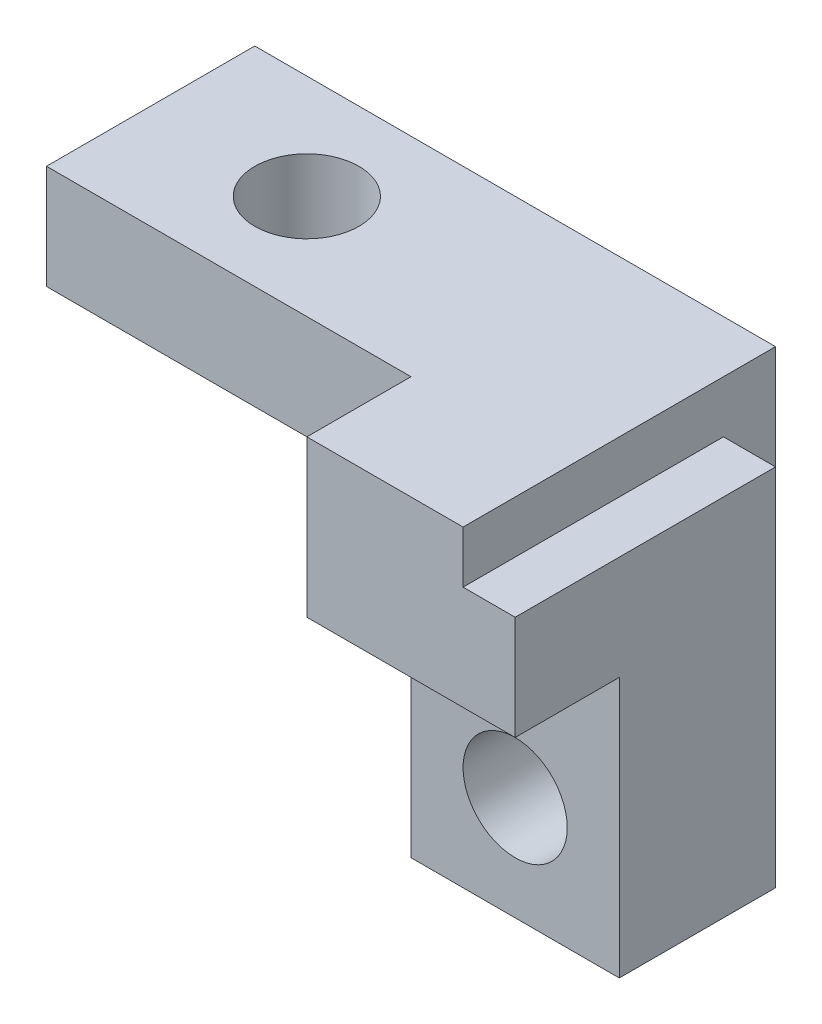
ISO-10303-21;
HEADER;
FILE_DESCRIPTION(('STEP AP214'),'2;1');
FILE_NAME('part.step','',(''),(''),'','','');
FILE_SCHEMA(('AUTOMOTIVE_DESIGN { 1 0 10303 214 1 1 1 1 }'));
ENDSEC;
DATA;
#1=APPLICATION_CONTEXT('core data for automotive mechanical design processes');
#2=APPLICATION_PROTOCOL_DEFINITION('international standard','automotive_design',2000,#1);
#3=PRODUCT_CONTEXT('',#1,'mechanical');
#4=PRODUCT('Part','Part','',(#3));
#5=PRODUCT_RELATED_PRODUCT_CATEGORY('part','',(#4));
#6=PRODUCT_DEFINITION_FORMATION('','',#4);
#7=PRODUCT_DEFINITION_CONTEXT('part definition',#1,'design');
#8=PRODUCT_DEFINITION('design','',#6,#7);
#9=PRODUCT_DEFINITION_SHAPE('','',#8);
#10=(LENGTH_UNIT() NAMED_UNIT(*) SI_UNIT(.MILLI.,.METRE.));
#11=(NAMED_UNIT(*) PLANE_ANGLE_UNIT() SI_UNIT($,.RADIAN.));
#12=(NAMED_UNIT(*) SI_UNIT($,.STERADIAN.) SOLID_ANGLE_UNIT());
#13=UNCERTAINTY_MEASURE_WITH_UNIT(LENGTH_MEASURE(1.E-05),#10,'distance_accuracy_value','');
#14=(GEOMETRIC_REPRESENTATION_CONTEXT(3) GLOBAL_UNCERTAINTY_ASSIGNED_CONTEXT((#13)) GLOBAL_UNIT_ASSIGNED_CONTEXT((#10,
#11,#12)) REPRESENTATION_CONTEXT('',''));
#15=CARTESIAN_POINT('',(0.,0.,0.));
#16=DIRECTION('',(0.,0.,1.));
#17=DIRECTION('',(1.,0.,0.));
#18=AXIS2_PLACEMENT_3D('',#15,#16,#17);
#19=CARTESIAN_POINT('',(241.3,28.575,-63.5));
#20=DIRECTION('',(1.,0.,0.));
#21=DIRECTION('',(0.,0.,-1.));
#22=AXIS2_PLACEMENT_3D('',#19,#20,#21);
#23=PLANE('',#22);
#24=DIRECTION('',(0.,0.,1.));
#25=VECTOR('',#24,1.);
#26=CARTESIAN_POINT('',(241.3,92.075,0.));
#27=LINE('',#26,#25);
#28=CARTESIAN_POINT('',(241.3,92.075,-25.4));
#29=VERTEX_POINT('',#28);
#30=CARTESIAN_POINT('',(241.3,92.075,0.));
#31=VERTEX_POINT('',#30);
#32=EDGE_CURVE('E148',#29,#31,#27,.T.);
#33=ORIENTED_EDGE('',*,*,#32,.F.);
#34=DIRECTION('',(0.,1.,0.));
#35=VECTOR('',#34,1.);
#36=CARTESIAN_POINT('',(241.3,92.075,-25.4));
#37=LINE('',#36,#35);
#38=CARTESIAN_POINT('',(241.3,28.575,-25.4));
#39=VERTEX_POINT('',#38);
#40=EDGE_CURVE('E139',#39,#29,#37,.T.);
#41=ORIENTED_EDGE('',*,*,#40,.F.);
#42=DIRECTION('',(0.,0.,-1.));
#43=VECTOR('',#42,1.);
#44=CARTESIAN_POINT('',(241.3,28.575,-63.5));
#45=LINE('',#44,#43);
#46=CARTESIAN_POINT('',(241.3,28.575,-63.5));
#47=VERTEX_POINT('',#46);
#48=EDGE_CURVE('E145',#39,#47,#45,.T.);
#49=ORIENTED_EDGE('',*,*,#48,.T.);
#50=DIRECTION('',(0.,1.,0.));
#51=VECTOR('',#50,1.);
#52=CARTESIAN_POINT('',(241.3,28.575,-63.5));
#53=LINE('',#52,#51);
#54=CARTESIAN_POINT('',(241.3,117.475,-63.5));
#55=VERTEX_POINT('',#54);
#56=EDGE_CURVE('E173',#47,#55,#53,.T.);
#57=ORIENTED_EDGE('',*,*,#56,.T.);
#58=DIRECTION('',(0.,0.,1.));
#59=VECTOR('',#58,1.);
#60=CARTESIAN_POINT('',(241.3,117.475,-76.2));
#61=LINE('',#60,#59);
#62=CARTESIAN_POINT('',(241.3,117.475,0.));
#63=VERTEX_POINT('',#62);
#64=EDGE_CURVE('E217',#55,#63,#61,.T.);
#65=ORIENTED_EDGE('',*,*,#64,.T.);
#66=DIRECTION('',(0.,1.,0.));
#67=VECTOR('',#66,1.);
#68=CARTESIAN_POINT('',(241.3,28.575,0.));
#69=LINE('',#68,#67);
#70=EDGE_CURVE('E188',#31,#63,#69,.T.);
#71=ORIENTED_EDGE('',*,*,#70,.F.);
#72=EDGE_LOOP('',(#33,#41,#49,#57,#65,#71));
#73=FACE_BOUND('',#72,.T.);
#74=ADVANCED_FACE('F50',(#73),#23,.T.);
#75=CARTESIAN_POINT('',(241.3,28.575,0.));
#76=DIRECTION('',(0.,0.,1.));
#77=DIRECTION('',(1.,0.,0.));
#78=AXIS2_PLACEMENT_3D('',#75,#76,#77);
#79=PLANE('',#78);
#80=DIRECTION('',(1.,0.,0.));
#81=VECTOR('',#80,1.);
#82=CARTESIAN_POINT('',(101.6,92.075,0.));
#83=LINE('',#82,#81);
#84=CARTESIAN_POINT('',(190.5,92.075,0.));
#85=VERTEX_POINT('',#84);
#86=EDGE_CURVE('E257',#85,#31,#83,.T.);
#87=ORIENTED_EDGE('',*,*,#86,.T.);
#88=ORIENTED_EDGE('',*,*,#70,.T.);
#89=DIRECTION('',(1.,0.,0.));
#90=VECTOR('',#89,1.);
#91=CARTESIAN_POINT('',(0.,117.475,0.));
#92=LINE('',#91,#90);
#93=CARTESIAN_POINT('',(228.6,117.475,0.));
#94=VERTEX_POINT('',#93);
#95=EDGE_CURVE('E224',#94,#63,#92,.T.);
#96=ORIENTED_EDGE('',*,*,#95,.F.);
#97=DIRECTION('',(0.,-1.,0.));
#98=VECTOR('',#97,1.);
#99=CARTESIAN_POINT('',(228.6,0.,0.));
#100=LINE('',#99,#98);
#101=CARTESIAN_POINT('',(228.6,130.175,0.));
#102=VERTEX_POINT('',#101);
#103=EDGE_CURVE('E222',#102,#94,#100,.T.);
#104=ORIENTED_EDGE('',*,*,#103,.F.);
#105=DIRECTION('',(1.,0.,0.));
#106=VECTOR('',#105,1.);
#107=CARTESIAN_POINT('',(241.3,130.175,0.));
#108=LINE('',#107,#106);
#109=CARTESIAN_POINT('',(190.5,130.175,0.));
#110=VERTEX_POINT('',#109);
#111=EDGE_CURVE('E156',#110,#102,#108,.T.);
#112=ORIENTED_EDGE('',*,*,#111,.F.);
#113=DIRECTION('',(0.,1.,0.));
#114=VECTOR('',#113,1.);
#115=CARTESIAN_POINT('',(190.5,28.575,0.));
#116=LINE('',#115,#114);
#117=EDGE_CURVE('E190',#85,#110,#116,.T.);
#118=ORIENTED_EDGE('',*,*,#117,.F.);
#119=EDGE_LOOP('',(#87,#88,#96,#104,#112,#118));
#120=FACE_BOUND('',#119,.T.);
#121=ADVANCED_FACE('F256',(#120),#79,.T.);
#122=CARTESIAN_POINT('',(190.5,28.575,0.));
#123=DIRECTION('',(-1.,0.,0.));
#124=DIRECTION('',(0.,0.,1.));
#125=AXIS2_PLACEMENT_3D('',#122,#123,#124);
#126=PLANE('',#125);
#127=DIRECTION('',(0.,0.,-1.));
#128=VECTOR('',#127,1.);
#129=CARTESIAN_POINT('',(190.5,92.075,0.));
#130=LINE('',#129,#128);
#131=CARTESIAN_POINT('',(190.5,92.075,-25.4));
#132=VERTEX_POINT('',#131);
#133=EDGE_CURVE('E14',#85,#132,#130,.T.);
#134=ORIENTED_EDGE('',*,*,#133,.F.);
#135=ORIENTED_EDGE('',*,*,#117,.T.);
#136=DIRECTION('',(0.,0.,1.));
#137=VECTOR('',#136,1.);
#138=CARTESIAN_POINT('',(190.5,130.175,0.));
#139=LINE('',#138,#137);
#140=CARTESIAN_POINT('',(190.5,130.175,-25.4));
#141=VERTEX_POINT('',#140);
#142=EDGE_CURVE('E161',#141,#110,#139,.T.);
#143=ORIENTED_EDGE('',*,*,#142,.F.);
#144=DIRECTION('',(0.,1.,0.));
#145=VECTOR('',#144,1.);
#146=CARTESIAN_POINT('',(190.5,28.575,-25.4));
#147=LINE('',#146,#145);
#148=CARTESIAN_POINT('',(190.5,104.775,-25.4));
#149=VERTEX_POINT('',#148);
#150=EDGE_CURVE('E192',#149,#141,#147,.T.);
#151=ORIENTED_EDGE('',*,*,#150,.F.);
#152=DIRECTION('',(0.,0.,1.));
#153=VECTOR('',#152,1.);
#154=CARTESIAN_POINT('',(190.5,104.775,-76.2));
#155=LINE('',#154,#153);
#156=CARTESIAN_POINT('',(190.5,104.775,-76.2));
#157=VERTEX_POINT('',#156);
#158=EDGE_CURVE('E237',#157,#149,#155,.T.);
#159=ORIENTED_EDGE('',*,*,#158,.F.);
#160=DIRECTION('',(0.,1.,0.));
#161=VECTOR('',#160,1.);
#162=CARTESIAN_POINT('',(190.5,92.075,-76.2));
#163=LINE('',#162,#161);
#164=CARTESIAN_POINT('',(190.5,28.575,-76.2));
#165=VERTEX_POINT('',#164);
#166=EDGE_CURVE('E227',#165,#157,#163,.T.);
#167=ORIENTED_EDGE('',*,*,#166,.F.);
#168=DIRECTION('',(0.,0.,1.));
#169=VECTOR('',#168,1.);
#170=CARTESIAN_POINT('',(190.5,28.575,0.));
#171=LINE('',#170,#169);
#172=CARTESIAN_POINT('',(190.5,28.575,-25.4));
#173=VERTEX_POINT('',#172);
#174=EDGE_CURVE('E71',#165,#173,#171,.T.);
#175=ORIENTED_EDGE('',*,*,#174,.T.);
#176=DIRECTION('',(0.,-1.,0.));
#177=VECTOR('',#176,1.);
#178=CARTESIAN_POINT('',(190.5,28.575,-25.4));
#179=LINE('',#178,#177);
#180=EDGE_CURVE('E64',#132,#173,#179,.T.);
#181=ORIENTED_EDGE('',*,*,#180,.F.);
#182=EDGE_LOOP('',(#134,#135,#143,#151,#159,#167,#175,#181));
#183=FACE_BOUND('',#182,.T.);
#184=ADVANCED_FACE('F291',(#183),#126,.T.);
#185=CARTESIAN_POINT('',(190.5,28.575,-25.4));
#186=DIRECTION('',(0.,0.,1.));
#187=DIRECTION('',(1.,0.,0.));
#188=AXIS2_PLACEMENT_3D('',#185,#186,#187);
#189=PLANE('',#188);
#190=DIRECTION('',(-1.,0.,0.));
#191=VECTOR('',#190,1.);
#192=CARTESIAN_POINT('',(190.5,104.775,-25.4));
#193=LINE('',#192,#191);
#194=CARTESIAN_POINT('',(101.6,104.775,-25.4));
#195=VERTEX_POINT('',#194);
#196=EDGE_CURVE('E207',#149,#195,#193,.T.);
#197=ORIENTED_EDGE('',*,*,#196,.F.);
#198=ORIENTED_EDGE('',*,*,#150,.T.);
#199=DIRECTION('',(1.,0.,0.));
#200=VECTOR('',#199,1.);
#201=CARTESIAN_POINT('',(190.5,130.175,-25.4));
#202=LINE('',#201,#200);
#203=CARTESIAN_POINT('',(101.6,130.175,-25.4));
#204=VERTEX_POINT('',#203);
#205=EDGE_CURVE('E183',#204,#141,#202,.T.);
#206=ORIENTED_EDGE('',*,*,#205,.F.);
#207=DIRECTION('',(0.,1.,0.));
#208=VECTOR('',#207,1.);
#209=CARTESIAN_POINT('',(101.6,28.575,-25.4));
#210=LINE('',#209,#208);
#211=EDGE_CURVE('E194',#195,#204,#210,.T.);
#212=ORIENTED_EDGE('',*,*,#211,.F.);
#213=EDGE_LOOP('',(#197,#198,#206,#212));
#214=FACE_BOUND('',#213,.T.);
#215=ADVANCED_FACE('F296',(#214),#189,.T.);
#216=CARTESIAN_POINT('',(101.6,28.575,-25.4));
#217=DIRECTION('',(-1.,0.,0.));
#218=DIRECTION('',(0.,0.,1.));
#219=AXIS2_PLACEMENT_3D('',#216,#217,#218);
#220=PLANE('',#219);
#221=DIRECTION('',(0.,0.,1.));
#222=VECTOR('',#221,1.);
#223=CARTESIAN_POINT('',(101.6,104.775,-76.2));
#224=LINE('',#223,#222);
#225=CARTESIAN_POINT('',(101.6,104.775,-76.2));
#226=VERTEX_POINT('',#225);
#227=EDGE_CURVE('E208',#226,#195,#224,.T.);
#228=ORIENTED_EDGE('',*,*,#227,.T.);
#229=ORIENTED_EDGE('',*,*,#211,.T.);
#230=DIRECTION('',(0.,0.,1.));
#231=VECTOR('',#230,1.);
#232=CARTESIAN_POINT('',(101.6,130.175,-25.4));
#233=LINE('',#232,#231);
#234=CARTESIAN_POINT('',(101.6,130.175,-76.2));
#235=VERTEX_POINT('',#234);
#236=EDGE_CURVE('E180',#235,#204,#233,.T.);
#237=ORIENTED_EDGE('',*,*,#236,.F.);
#238=DIRECTION('',(0.,1.,0.));
#239=VECTOR('',#238,1.);
#240=CARTESIAN_POINT('',(101.6,28.575,-76.2));
#241=LINE('',#240,#239);
#242=EDGE_CURVE('E196',#226,#235,#241,.T.);
#243=ORIENTED_EDGE('',*,*,#242,.F.);
#244=EDGE_LOOP('',(#228,#229,#237,#243));
#245=FACE_BOUND('',#244,.T.);
#246=ADVANCED_FACE('F303',(#245),#220,.T.);
#247=CARTESIAN_POINT('',(101.6,28.575,-76.2));
#248=DIRECTION('',(0.,0.,-1.));
#249=DIRECTION('',(-1.,0.,0.));
#250=AXIS2_PLACEMENT_3D('',#247,#248,#249);
#251=PLANE('',#250);
#252=DIRECTION('',(-1.,0.,0.));
#253=VECTOR('',#252,1.);
#254=CARTESIAN_POINT('',(190.5,104.775,-76.2));
#255=LINE('',#254,#253);
#256=EDGE_CURVE('E230',#157,#226,#255,.T.);
#257=ORIENTED_EDGE('',*,*,#256,.T.);
#258=ORIENTED_EDGE('',*,*,#242,.T.);
#259=DIRECTION('',(-1.,0.,0.));
#260=VECTOR('',#259,1.);
#261=CARTESIAN_POINT('',(101.6,130.175,-76.2));
#262=LINE('',#261,#260);
#263=CARTESIAN_POINT('',(228.6,130.175,-76.2));
#264=VERTEX_POINT('',#263);
#265=EDGE_CURVE('E177',#264,#235,#262,.T.);
#266=ORIENTED_EDGE('',*,*,#265,.F.);
#267=DIRECTION('',(0.,1.,0.));
#268=VECTOR('',#267,1.);
#269=CARTESIAN_POINT('',(228.6,28.575,-76.2));
#270=LINE('',#269,#268);
#271=CARTESIAN_POINT('',(228.6,28.575,-76.2));
#272=VERTEX_POINT('',#271);
#273=EDGE_CURVE('E198',#272,#264,#270,.T.);
#274=ORIENTED_EDGE('',*,*,#273,.F.);
#275=DIRECTION('',(-1.,0.,0.));
#276=VECTOR('',#275,1.);
#277=CARTESIAN_POINT('',(101.6,28.575,-76.2));
#278=LINE('',#277,#276);
#279=EDGE_CURVE('E169',#272,#165,#278,.T.);
#280=ORIENTED_EDGE('',*,*,#279,.T.);
#281=ORIENTED_EDGE('',*,*,#166,.T.);
#282=EDGE_LOOP('',(#257,#258,#266,#274,#280,#281));
#283=FACE_BOUND('',#282,.T.);
#284=ADVANCED_FACE('F307',(#283),#251,.T.);
#285=CARTESIAN_POINT('',(228.6,28.575,-76.2));
#286=DIRECTION('',(1.,0.,0.));
#287=DIRECTION('',(0.,0.,-1.));
#288=AXIS2_PLACEMENT_3D('',#285,#286,#287);
#289=PLANE('',#288);
#290=ORIENTED_EDGE('',*,*,#273,.T.);
#291=DIRECTION('',(0.,0.,-1.));
#292=VECTOR('',#291,1.);
#293=CARTESIAN_POINT('',(228.6,130.175,-76.2));
#294=LINE('',#293,#292);
#295=EDGE_CURVE('E174',#102,#264,#294,.T.);
#296=ORIENTED_EDGE('',*,*,#295,.F.);
#297=ORIENTED_EDGE('',*,*,#103,.T.);
#298=DIRECTION('',(0.,0.,1.));
#299=VECTOR('',#298,1.);
#300=CARTESIAN_POINT('',(228.6,117.475,-76.2));
#301=LINE('',#300,#299);
#302=CARTESIAN_POINT('',(228.6,117.475,-63.5));
#303=VERTEX_POINT('',#302);
#304=EDGE_CURVE('E214',#303,#94,#301,.T.);
#305=ORIENTED_EDGE('',*,*,#304,.F.);
#306=DIRECTION('',(0.,1.,0.));
#307=VECTOR('',#306,1.);
#308=CARTESIAN_POINT('',(228.6,28.575,-63.5));
#309=LINE('',#308,#307);
#310=CARTESIAN_POINT('',(228.6,28.575,-63.5));
#311=VERTEX_POINT('',#310);
#312=EDGE_CURVE('E200',#311,#303,#309,.T.);
#313=ORIENTED_EDGE('',*,*,#312,.F.);
#314=DIRECTION('',(0.,0.,-1.));
#315=VECTOR('',#314,1.);
#316=CARTESIAN_POINT('',(228.6,28.575,-76.2));
#317=LINE('',#316,#315);
#318=EDGE_CURVE('E158',#311,#272,#317,.T.);
#319=ORIENTED_EDGE('',*,*,#318,.T.);
#320=EDGE_LOOP('',(#290,#296,#297,#305,#313,#319));
#321=FACE_BOUND('',#320,.T.);
#322=ADVANCED_FACE('F220',(#321),#289,.T.);
#323=CARTESIAN_POINT('',(228.6,28.575,-63.5));
#324=DIRECTION('',(0.,0.,-1.));
#325=DIRECTION('',(-1.,0.,0.));
#326=AXIS2_PLACEMENT_3D('',#323,#324,#325);
#327=PLANE('',#326);
#328=DIRECTION('',(-1.,0.,0.));
#329=VECTOR('',#328,1.);
#330=CARTESIAN_POINT('',(228.6,117.475,-63.5));
#331=LINE('',#330,#329);
#332=EDGE_CURVE('E142',#55,#303,#331,.T.);
#333=ORIENTED_EDGE('',*,*,#332,.F.);
#334=ORIENTED_EDGE('',*,*,#56,.F.);
#335=DIRECTION('',(-1.,0.,0.));
#336=VECTOR('',#335,1.);
#337=CARTESIAN_POINT('',(228.6,28.575,-63.5));
#338=LINE('',#337,#336);
#339=EDGE_CURVE('E155',#47,#311,#338,.T.);
#340=ORIENTED_EDGE('',*,*,#339,.T.);
#341=ORIENTED_EDGE('',*,*,#312,.T.);
#342=EDGE_LOOP('',(#333,#334,#340,#341));
#343=FACE_BOUND('',#342,.T.);
#344=ADVANCED_FACE('F226',(#343),#327,.T.);
#345=CARTESIAN_POINT('',(0.,28.575,0.));
#346=DIRECTION('',(0.,-1.,0.));
#347=DIRECTION('',(0.,0.,-1.));
#348=AXIS2_PLACEMENT_3D('',#345,#346,#347);
#349=PLANE('',#348);
#350=DIRECTION('',(1.,0.,0.));
#351=VECTOR('',#350,1.);
#352=CARTESIAN_POINT('',(0.,28.575,-25.4));
#353=LINE('',#352,#351);
#354=EDGE_CURVE('E57',#173,#39,#353,.T.);
#355=ORIENTED_EDGE('',*,*,#354,.F.);
#356=ORIENTED_EDGE('',*,*,#174,.F.);
#357=ORIENTED_EDGE('',*,*,#279,.F.);
#358=ORIENTED_EDGE('',*,*,#318,.F.);
#359=ORIENTED_EDGE('',*,*,#339,.F.);
#360=ORIENTED_EDGE('',*,*,#48,.F.);
#361=EDGE_LOOP('',(#355,#356,#357,#358,#359,#360));
#362=FACE_BOUND('',#361,.T.);
#363=ADVANCED_FACE('F152',(#362),#349,.T.);
#364=CARTESIAN_POINT('',(0.,130.175,0.));
#365=DIRECTION('',(0.,-1.,0.));
#366=DIRECTION('',(0.,0.,-1.));
#367=AXIS2_PLACEMENT_3D('',#364,#365,#366);
#368=PLANE('',#367);
#369=CARTESIAN_POINT('',(139.7,130.175,-50.8));
#370=DIRECTION('',(0.,1.,0.));
#371=DIRECTION('',(0.,0.,1.));
#372=AXIS2_PLACEMENT_3D('',#369,#370,#371);
#373=CIRCLE('',#372,12.7);
#374=CARTESIAN_POINT('',(139.7,130.175,-38.1));
#375=VERTEX_POINT('',#374);
#376=EDGE_CURVE('E164',#375,#375,#373,.T.);
#377=ORIENTED_EDGE('',*,*,#376,.F.);
#378=EDGE_LOOP('',(#377));
#379=FACE_BOUND('',#378,.T.);
#380=ORIENTED_EDGE('',*,*,#111,.T.);
#381=ORIENTED_EDGE('',*,*,#295,.T.);
#382=ORIENTED_EDGE('',*,*,#265,.T.);
#383=ORIENTED_EDGE('',*,*,#236,.T.);
#384=ORIENTED_EDGE('',*,*,#205,.T.);
#385=ORIENTED_EDGE('',*,*,#142,.T.);
#386=EDGE_LOOP('',(#380,#381,#382,#383,#384,#385));
#387=FACE_BOUND('',#386,.T.);
#388=ADVANCED_FACE('F247',(#379,#387),#368,.F.);
#389=CARTESIAN_POINT('',(139.7,28.575,-50.8));
#390=DIRECTION('',(0.,1.,0.));
#391=DIRECTION('',(0.,0.,1.));
#392=AXIS2_PLACEMENT_3D('',#389,#390,#391);
#393=CYLINDRICAL_SURFACE('',#392,12.7);
#394=CARTESIAN_POINT('',(139.7,104.775,-50.8));
#395=DIRECTION('',(0.,1.,0.));
#396=DIRECTION('',(0.,0.,1.));
#397=AXIS2_PLACEMENT_3D('',#394,#395,#396);
#398=CIRCLE('',#397,12.7);
#399=CARTESIAN_POINT('',(139.7,104.775,-38.1));
#400=VERTEX_POINT('',#399);
#401=EDGE_CURVE('E204',#400,#400,#398,.F.);
#402=ORIENTED_EDGE('',*,*,#401,.T.);
#403=EDGE_LOOP('',(#402));
#404=FACE_BOUND('',#403,.T.);
#405=ORIENTED_EDGE('',*,*,#376,.T.);
#406=EDGE_LOOP('',(#405));
#407=FACE_BOUND('',#406,.T.);
#408=ADVANCED_FACE('F245',(#404,#407),#393,.F.);
#409=CARTESIAN_POINT('',(127.,104.775,-76.2));
#410=DIRECTION('',(0.,1.,0.));
#411=DIRECTION('',(0.,0.,1.));
#412=AXIS2_PLACEMENT_3D('',#409,#410,#411);
#413=PLANE('',#412);
#414=ORIENTED_EDGE('',*,*,#196,.T.);
#415=ORIENTED_EDGE('',*,*,#227,.F.);
#416=ORIENTED_EDGE('',*,*,#256,.F.);
#417=ORIENTED_EDGE('',*,*,#158,.T.);
#418=EDGE_LOOP('',(#414,#415,#416,#417));
#419=FACE_BOUND('',#418,.T.);
#420=ORIENTED_EDGE('',*,*,#401,.F.);
#421=EDGE_LOOP('',(#420));
#422=FACE_BOUND('',#421,.T.);
#423=ADVANCED_FACE('F322',(#419,#422),#413,.F.);
#424=CARTESIAN_POINT('',(0.,117.475,-76.2));
#425=DIRECTION('',(0.,-1.,0.));
#426=DIRECTION('',(0.,0.,-1.));
#427=AXIS2_PLACEMENT_3D('',#424,#425,#426);
#428=PLANE('',#427);
#429=ORIENTED_EDGE('',*,*,#332,.T.);
#430=ORIENTED_EDGE('',*,*,#304,.T.);
#431=ORIENTED_EDGE('',*,*,#95,.T.);
#432=ORIENTED_EDGE('',*,*,#64,.F.);
#433=EDGE_LOOP('',(#429,#430,#431,#432));
#434=FACE_BOUND('',#433,.T.);
#435=ADVANCED_FACE('F212',(#434),#428,.F.);
#436=CARTESIAN_POINT('',(101.6,92.075,0.));
#437=DIRECTION('',(0.,1.,0.));
#438=DIRECTION('',(0.,0.,1.));
#439=AXIS2_PLACEMENT_3D('',#436,#437,#438);
#440=PLANE('',#439);
#441=ORIENTED_EDGE('',*,*,#133,.T.);
#442=DIRECTION('',(1.,0.,0.));
#443=VECTOR('',#442,1.);
#444=CARTESIAN_POINT('',(101.6,92.075,-25.4));
#445=LINE('',#444,#443);
#446=EDGE_CURVE('E260',#132,#29,#445,.T.);
#447=ORIENTED_EDGE('',*,*,#446,.T.);
#448=ORIENTED_EDGE('',*,*,#32,.T.);
#449=ORIENTED_EDGE('',*,*,#86,.F.);
#450=EDGE_LOOP('',(#441,#447,#448,#449));
#451=FACE_BOUND('',#450,.T.);
#452=ADVANCED_FACE('F279',(#451),#440,.F.);
#453=CARTESIAN_POINT('',(101.6,92.075,-25.4));
#454=DIRECTION('',(0.,0.,-1.));
#455=DIRECTION('',(-1.,0.,0.));
#456=AXIS2_PLACEMENT_3D('',#453,#454,#455);
#457=PLANE('',#456);
#458=CARTESIAN_POINT('',(215.9,53.975,-25.4));
#459=DIRECTION('',(0.,0.,1.));
#460=DIRECTION('',(1.,0.,0.));
#461=AXIS2_PLACEMENT_3D('',#458,#459,#460);
#462=CIRCLE('',#461,12.7);
#463=CARTESIAN_POINT('',(228.6,53.975,-25.4));
#464=VERTEX_POINT('',#463);
#465=EDGE_CURVE('E264',#464,#464,#462,.T.);
#466=ORIENTED_EDGE('',*,*,#465,.F.);
#467=EDGE_LOOP('',(#466));
#468=FACE_BOUND('',#467,.T.);
#469=ORIENTED_EDGE('',*,*,#180,.T.);
#470=ORIENTED_EDGE('',*,*,#354,.T.);
#471=ORIENTED_EDGE('',*,*,#40,.T.);
#472=ORIENTED_EDGE('',*,*,#446,.F.);
#473=EDGE_LOOP('',(#469,#470,#471,#472));
#474=FACE_BOUND('',#473,.T.);
#475=ADVANCED_FACE('F138',(#468,#474),#457,.F.);
#476=CARTESIAN_POINT('',(215.9,53.975,-60.96));
#477=DIRECTION('',(0.,0.,1.));
#478=DIRECTION('',(1.,0.,0.));
#479=AXIS2_PLACEMENT_3D('',#476,#477,#478);
#480=CYLINDRICAL_SURFACE('',#479,12.7);
#481=CARTESIAN_POINT('',(215.9,53.975,-60.96));
#482=DIRECTION('',(0.,0.,1.));
#483=DIRECTION('',(1.,0.,0.));
#484=AXIS2_PLACEMENT_3D('',#481,#482,#483);
#485=CIRCLE('',#484,12.7);
#486=CARTESIAN_POINT('',(228.6,53.975,-60.96));
#487=VERTEX_POINT('',#486);
#488=EDGE_CURVE('E149',#487,#487,#485,.T.);
#489=CARTESIAN_POINT('',(228.6,53.975,-60.96));
#490=CARTESIAN_POINT('',(228.6,53.975,-60.5895833333333));
#491=CARTESIAN_POINT('',(228.6,53.975,-60.2191666666667));
#492=CARTESIAN_POINT('',(228.6,53.975,-59.4783333333333));
#493=CARTESIAN_POINT('',(228.6,53.975,-59.1079166666666));
#494=CARTESIAN_POINT('',(228.6,53.975,-58.3670833333333));
#495=CARTESIAN_POINT('',(228.6,53.975,-57.9966666666666));
#496=CARTESIAN_POINT('',(228.6,53.975,-57.2558333333333));
#497=CARTESIAN_POINT('',(228.6,53.975,-56.8854166666667));
#498=CARTESIAN_POINT('',(228.6,53.975,-56.1445833333333));
#499=CARTESIAN_POINT('',(228.6,53.975,-55.7741666666666));
#500=CARTESIAN_POINT('',(228.6,53.975,-55.0333333333333));
#501=CARTESIAN_POINT('',(228.6,53.975,-54.6629166666666));
#502=CARTESIAN_POINT('',(228.6,53.975,-53.9220833333333));
#503=CARTESIAN_POINT('',(228.6,53.975,-53.5516666666666));
#504=CARTESIAN_POINT('',(228.6,53.975,-52.8108333333333));
#505=CARTESIAN_POINT('',(228.6,53.975,-52.4404166666666));
#506=CARTESIAN_POINT('',(228.6,53.975,-51.6995833333333));
#507=CARTESIAN_POINT('',(228.6,53.975,-51.3291666666667));
#508=CARTESIAN_POINT('',(228.6,53.975,-50.5883333333333));
#509=CARTESIAN_POINT('',(228.6,53.975,-50.2179166666666));
#510=CARTESIAN_POINT('',(228.6,53.975,-49.4770833333333));
#511=CARTESIAN_POINT('',(228.6,53.975,-49.1066666666666));
#512=CARTESIAN_POINT('',(228.6,53.975,-48.3658333333333));
#513=CARTESIAN_POINT('',(228.6,53.975,-47.9954166666666));
#514=CARTESIAN_POINT('',(228.6,53.975,-47.2545833333333));
#515=CARTESIAN_POINT('',(228.6,53.975,-46.8841666666666));
#516=CARTESIAN_POINT('',(228.6,53.975,-46.1433333333333));
#517=CARTESIAN_POINT('',(228.6,53.975,-45.7729166666666));
#518=CARTESIAN_POINT('',(228.6,53.975,-45.0320833333333));
#519=CARTESIAN_POINT('',(228.6,53.975,-44.6616666666666));
#520=CARTESIAN_POINT('',(228.6,53.975,-43.9208333333333));
#521=CARTESIAN_POINT('',(228.6,53.975,-43.5504166666666));
#522=CARTESIAN_POINT('',(228.6,53.975,-42.8095833333333));
#523=CARTESIAN_POINT('',(228.6,53.975,-42.4391666666666));
#524=CARTESIAN_POINT('',(228.6,53.975,-41.6983333333333));
#525=CARTESIAN_POINT('',(228.6,53.975,-41.3279166666666));
#526=CARTESIAN_POINT('',(228.6,53.975,-40.5870833333333));
#527=CARTESIAN_POINT('',(228.6,53.975,-40.2166666666666));
#528=CARTESIAN_POINT('',(228.6,53.975,-39.4758333333333));
#529=CARTESIAN_POINT('',(228.6,53.975,-39.1054166666666));
#530=CARTESIAN_POINT('',(228.6,53.975,-38.3645833333333));
#531=CARTESIAN_POINT('',(228.6,53.975,-37.9941666666667));
#532=CARTESIAN_POINT('',(228.6,53.975,-37.2533333333333));
#533=CARTESIAN_POINT('',(228.6,53.975,-36.8829166666666));
#534=CARTESIAN_POINT('',(228.6,53.975,-36.1420833333333));
#535=CARTESIAN_POINT('',(228.6,53.975,-35.7716666666666));
#536=CARTESIAN_POINT('',(228.6,53.975,-35.0308333333333));
#537=CARTESIAN_POINT('',(228.6,53.975,-34.6604166666666));
#538=CARTESIAN_POINT('',(228.6,53.975,-33.9195833333333));
#539=CARTESIAN_POINT('',(228.6,53.975,-33.5491666666666));
#540=CARTESIAN_POINT('',(228.6,53.975,-32.8083333333333));
#541=CARTESIAN_POINT('',(228.6,53.975,-32.4379166666666));
#542=CARTESIAN_POINT('',(228.6,53.975,-31.6970833333333));
#543=CARTESIAN_POINT('',(228.6,53.975,-31.3266666666667));
#544=CARTESIAN_POINT('',(228.6,53.975,-30.5858333333333));
#545=CARTESIAN_POINT('',(228.6,53.975,-30.2154166666666));
#546=CARTESIAN_POINT('',(228.6,53.975,-29.4745833333333));
#547=CARTESIAN_POINT('',(228.6,53.975,-29.1041666666666));
#548=CARTESIAN_POINT('',(228.6,53.975,-28.3633333333333));
#549=CARTESIAN_POINT('',(228.6,53.975,-27.9929166666666));
#550=CARTESIAN_POINT('',(228.6,53.975,-27.2520833333333));
#551=CARTESIAN_POINT('',(228.6,53.975,-26.8816666666666));
#552=CARTESIAN_POINT('',(228.6,53.975,-26.1408333333333));
#553=CARTESIAN_POINT('',(228.6,53.975,-25.7704166666666));
#554=CARTESIAN_POINT('',(228.6,53.975,-25.4));
#555=B_SPLINE_CURVE_WITH_KNOTS('',3,(#489,#490,#491,#492,#493,#494,#495,#496,#497,#498,#499,
#500,#501,#502,#503,#504,#505,#506,#507,#508,#509,#510,#511,#512,#513,#514,#515,#516,#517,#518,
#519,#520,#521,#522,#523,#524,#525,#526,#527,#528,#529,#530,#531,#532,#533,#534,#535,#536,#537,
#538,#539,#540,#541,#542,#543,#544,#545,#546,#547,#548,#549,#550,#551,#552,#553,#554),
.UNSPECIFIED.,.F.,.F.,(4,2,2,2,2,2,2,2,2,2,2,2,2,2,2,2,2,2,2,2,2,2,2,2,2,2,2,2,2,2,2,2,4),(0.,
1.11124999999999,2.2225,3.33375,4.445,5.55625,6.6675,7.77874999999999,8.89,10.00125,11.1125,
12.22375,13.335,14.44625,15.5575,16.66875,17.78,18.89125,20.0025,21.11375,22.225,23.33625,
24.4475,25.55875,26.67,27.78125,28.8925,30.00375,31.115,32.22625,33.3375,34.44875,35.56),.UNSPECIFIED.);
#556=EDGE_CURVE('BSEAM272',#487,#464,#555,.T.);
#557=ORIENTED_EDGE('',*,*,#488,.F.);
#558=ORIENTED_EDGE('',*,*,#465,.T.);
#559=ORIENTED_EDGE('',*,*,#556,.T.);
#560=ORIENTED_EDGE('',*,*,#556,.F.);
#561=EDGE_LOOP('',(#557,#559,#558,#560));
#562=FACE_BOUND('',#561,.T.);
#563=ADVANCED_FACE('F272',(#562),#480,.F.);
#564=CARTESIAN_POINT('',(215.9,53.975,-60.96));
#565=DIRECTION('',(0.,0.,1.));
#566=DIRECTION('',(1.,0.,0.));
#567=AXIS2_PLACEMENT_3D('',#564,#565,#566);
#568=PLANE('',#567);
#569=ORIENTED_EDGE('',*,*,#488,.T.);
#570=EDGE_LOOP('',(#569));
#571=FACE_BOUND('',#570,.T.);
#572=ADVANCED_FACE('F270',(#571),#568,.T.);
#573=CLOSED_SHELL('',(#74,#121,#184,#215,#246,#284,#322,#344,#363,#388,#408,#423,#435,#452,#475,
#563,#572));
#574=MANIFOLD_SOLID_BREP('B2',#573);
#575=ADVANCED_BREP_SHAPE_REPRESENTATION('',(#18,#574),#14);
#576=SHAPE_DEFINITION_REPRESENTATION(#9,#575);
ENDSEC;
END-ISO-10303-21;
